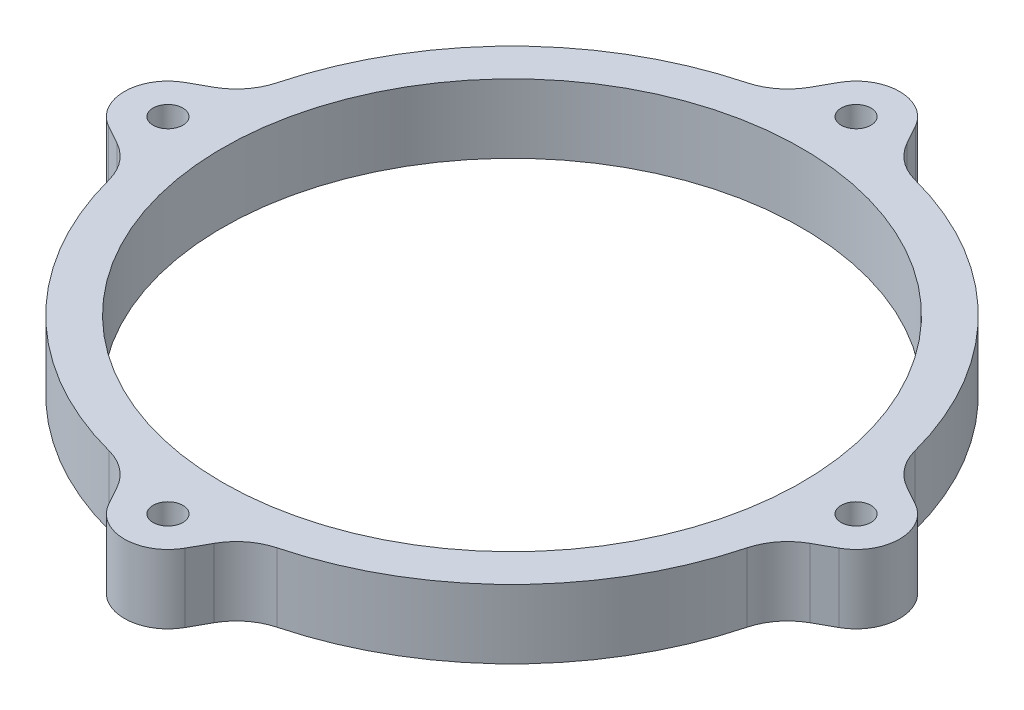
ISO-10303-21;
HEADER;
FILE_DESCRIPTION(('STEP AP214'),'2;1');
FILE_NAME('part.step','',(''),(''),'','','');
FILE_SCHEMA(('AUTOMOTIVE_DESIGN { 1 0 10303 214 1 1 1 1 }'));
ENDSEC;
DATA;
#1=APPLICATION_CONTEXT('core data for automotive mechanical design processes');
#2=APPLICATION_PROTOCOL_DEFINITION('international standard','automotive_design',2000,#1);
#3=PRODUCT_CONTEXT('',#1,'mechanical');
#4=PRODUCT('Part','Part','',(#3));
#5=PRODUCT_RELATED_PRODUCT_CATEGORY('part','',(#4));
#6=PRODUCT_DEFINITION_FORMATION('','',#4);
#7=PRODUCT_DEFINITION_CONTEXT('part definition',#1,'design');
#8=PRODUCT_DEFINITION('design','',#6,#7);
#9=PRODUCT_DEFINITION_SHAPE('','',#8);
#10=(LENGTH_UNIT() NAMED_UNIT(*) SI_UNIT(.MILLI.,.METRE.));
#11=(NAMED_UNIT(*) PLANE_ANGLE_UNIT() SI_UNIT($,.RADIAN.));
#12=(NAMED_UNIT(*) SI_UNIT($,.STERADIAN.) SOLID_ANGLE_UNIT());
#13=UNCERTAINTY_MEASURE_WITH_UNIT(LENGTH_MEASURE(1.E-05),#10,'distance_accuracy_value','');
#14=(GEOMETRIC_REPRESENTATION_CONTEXT(3) GLOBAL_UNCERTAINTY_ASSIGNED_CONTEXT((#13)) GLOBAL_UNIT_ASSIGNED_CONTEXT((#10,
#11,#12)) REPRESENTATION_CONTEXT('',''));
#15=CARTESIAN_POINT('',(0.,0.,0.));
#16=DIRECTION('',(0.,0.,1.));
#17=DIRECTION('',(1.,0.,0.));
#18=AXIS2_PLACEMENT_3D('',#15,#16,#17);
#19=CARTESIAN_POINT('',(0.,12.,-60.));
#20=DIRECTION('',(0.,1.,0.));
#21=DIRECTION('',(0.,0.,1.));
#22=AXIS2_PLACEMENT_3D('',#19,#20,#21);
#23=PLANE('',#22);
#24=CARTESIAN_POINT('',(0.,12.,59.9999999999995));
#25=DIRECTION('',(0.,1.,0.));
#26=DIRECTION('',(0.,0.,1.));
#27=AXIS2_PLACEMENT_3D('',#24,#25,#26);
#28=CIRCLE('',#27,2.6);
#29=CARTESIAN_POINT('',(0.,12.,62.5999999999995));
#30=VERTEX_POINT('',#29);
#31=EDGE_CURVE('E439',#30,#30,#28,.T.);
#32=ORIENTED_EDGE('',*,*,#31,.F.);
#33=EDGE_LOOP('',(#32));
#34=FACE_BOUND('',#33,.T.);
#35=CARTESIAN_POINT('',(0.,12.,-60.));
#36=DIRECTION('',(0.,1.,0.));
#37=DIRECTION('',(0.,0.,1.));
#38=AXIS2_PLACEMENT_3D('',#35,#36,#37);
#39=CIRCLE('',#38,2.6);
#40=CARTESIAN_POINT('',(0.,12.,-57.4));
#41=VERTEX_POINT('',#40);
#42=EDGE_CURVE('E427',#41,#41,#39,.T.);
#43=ORIENTED_EDGE('',*,*,#42,.F.);
#44=EDGE_LOOP('',(#43));
#45=FACE_BOUND('',#44,.T.);
#46=CARTESIAN_POINT('',(0.,12.,-60.));
#47=DIRECTION('',(0.,1.,0.));
#48=DIRECTION('',(0.,0.,1.));
#49=AXIS2_PLACEMENT_3D('',#46,#47,#48);
#50=CIRCLE('',#49,7.60000000000001);
#51=CARTESIAN_POINT('',(6.64110523457601,12.,-63.6953648349367));
#52=VERTEX_POINT('',#51);
#53=CARTESIAN_POINT('',(-6.64110523457601,12.,-63.6953648349368));
#54=VERTEX_POINT('',#53);
#55=EDGE_CURVE('E206',#52,#54,#50,.T.);
#56=ORIENTED_EDGE('',*,*,#55,.T.);
#57=DIRECTION('',(-0.486232215123255,0.,0.873829636128423));
#58=VECTOR('',#57,1.);
#59=CARTESIAN_POINT('',(-6.64110523457601,12.,-63.6953648349368));
#60=LINE('',#59,#58);
#61=CARTESIAN_POINT('',(-8.47082751707193,12.,-60.4070891785733));
#62=VERTEX_POINT('',#61);
#63=EDGE_CURVE('E194',#54,#62,#60,.T.);
#64=ORIENTED_EDGE('',*,*,#63,.T.);
#65=CARTESIAN_POINT('',(-17.2091238783562,12.,-65.2694113298059));
#66=DIRECTION('',(0.,1.,0.));
#67=DIRECTION('',(0.,0.,1.));
#68=AXIS2_PLACEMENT_3D('',#65,#66,#67);
#69=CIRCLE('',#68,10.);
#70=CARTESIAN_POINT('',(-14.6596240445256,12.,-55.5998689105754));
#71=VERTEX_POINT('',#70);
#72=EDGE_CURVE('E279',#62,#71,#69,.F.);
#73=ORIENTED_EDGE('',*,*,#72,.T.);
#74=CARTESIAN_POINT('',(0.,12.,0.));
#75=DIRECTION('',(0.,1.,0.));
#76=DIRECTION('',(0.,0.,1.));
#77=AXIS2_PLACEMENT_3D('',#74,#75,#76);
#78=CIRCLE('',#77,57.5);
#79=CARTESIAN_POINT('',(-55.5998689105754,12.,-14.6596240445256));
#80=VERTEX_POINT('',#79);
#81=EDGE_CURVE('E205',#71,#80,#78,.T.);
#82=ORIENTED_EDGE('',*,*,#81,.T.);
#83=CARTESIAN_POINT('',(-65.2694113298059,12.,-17.2091238783561));
#84=DIRECTION('',(0.,1.,0.));
#85=DIRECTION('',(0.,0.,1.));
#86=AXIS2_PLACEMENT_3D('',#83,#84,#85);
#87=CIRCLE('',#86,10.);
#88=CARTESIAN_POINT('',(-60.4070891785733,12.,-8.47082751707192));
#89=VERTEX_POINT('',#88);
#90=EDGE_CURVE('E283',#80,#89,#87,.F.);
#91=ORIENTED_EDGE('',*,*,#90,.T.);
#92=DIRECTION('',(-0.873829636128422,0.,0.486232215123257));
#93=VECTOR('',#92,1.);
#94=CARTESIAN_POINT('',(-63.6953648349367,12.,-6.641105234576));
#95=LINE('',#94,#93);
#96=CARTESIAN_POINT('',(-63.6953648349368,12.,-6.64110523457601));
#97=VERTEX_POINT('',#96);
#98=EDGE_CURVE('E377',#89,#97,#95,.T.);
#99=ORIENTED_EDGE('',*,*,#98,.T.);
#100=CARTESIAN_POINT('',(-59.9999999999997,12.,0.));
#101=DIRECTION('',(0.,1.,0.));
#102=DIRECTION('',(0.,0.,1.));
#103=AXIS2_PLACEMENT_3D('',#100,#101,#102);
#104=CIRCLE('',#103,7.60000000000016);
#105=CARTESIAN_POINT('',(-63.6953648349368,12.,6.64110523457603));
#106=VERTEX_POINT('',#105);
#107=EDGE_CURVE('E374',#97,#106,#104,.T.);
#108=ORIENTED_EDGE('',*,*,#107,.T.);
#109=DIRECTION('',(0.873829636128423,0.,0.486232215123255));
#110=VECTOR('',#109,1.);
#111=CARTESIAN_POINT('',(-63.6953648349368,12.,6.64110523457603));
#112=LINE('',#111,#110);
#113=CARTESIAN_POINT('',(-60.4070891785733,12.,8.47082751707194));
#114=VERTEX_POINT('',#113);
#115=EDGE_CURVE('E366',#106,#114,#112,.T.);
#116=ORIENTED_EDGE('',*,*,#115,.T.);
#117=CARTESIAN_POINT('',(-65.2694113298059,12.,17.2091238783562));
#118=DIRECTION('',(0.,1.,0.));
#119=DIRECTION('',(0.,0.,1.));
#120=AXIS2_PLACEMENT_3D('',#117,#118,#119);
#121=CIRCLE('',#120,10.);
#122=CARTESIAN_POINT('',(-55.5998689105754,12.,14.6596240445256));
#123=VERTEX_POINT('',#122);
#124=EDGE_CURVE('E287',#114,#123,#121,.F.);
#125=ORIENTED_EDGE('',*,*,#124,.T.);
#126=CARTESIAN_POINT('',(0.,12.,0.));
#127=DIRECTION('',(0.,1.,0.));
#128=DIRECTION('',(0.,0.,1.));
#129=AXIS2_PLACEMENT_3D('',#126,#127,#128);
#130=CIRCLE('',#129,57.5);
#131=CARTESIAN_POINT('',(-14.6596240445256,12.,55.5998689105754));
#132=VERTEX_POINT('',#131);
#133=EDGE_CURVE('E298',#123,#132,#130,.T.);
#134=ORIENTED_EDGE('',*,*,#133,.T.);
#135=CARTESIAN_POINT('',(-17.2091238783561,12.,65.2694113298059));
#136=DIRECTION('',(0.,1.,0.));
#137=DIRECTION('',(0.,0.,1.));
#138=AXIS2_PLACEMENT_3D('',#135,#136,#137);
#139=CIRCLE('',#138,10.);
#140=CARTESIAN_POINT('',(-8.47082751707192,12.,60.4070891785733));
#141=VERTEX_POINT('',#140);
#142=EDGE_CURVE('E291',#132,#141,#139,.F.);
#143=ORIENTED_EDGE('',*,*,#142,.T.);
#144=DIRECTION('',(0.486232215123257,0.,0.873829636128422));
#145=VECTOR('',#144,1.);
#146=CARTESIAN_POINT('',(-6.641105234576,12.,63.6953648349367));
#147=LINE('',#146,#145);
#148=CARTESIAN_POINT('',(-6.64110523457602,12.,63.6953648349367));
#149=VERTEX_POINT('',#148);
#150=EDGE_CURVE('E295',#141,#149,#147,.T.);
#151=ORIENTED_EDGE('',*,*,#150,.T.);
#152=CARTESIAN_POINT('',(0.,12.,59.9999999999995));
#153=DIRECTION('',(0.,1.,0.));
#154=DIRECTION('',(0.,0.,1.));
#155=AXIS2_PLACEMENT_3D('',#152,#153,#154);
#156=CIRCLE('',#155,7.60000000000023);
#157=CARTESIAN_POINT('',(6.64110523457602,12.,63.6953648349368));
#158=VERTEX_POINT('',#157);
#159=EDGE_CURVE('E308',#149,#158,#156,.T.);
#160=ORIENTED_EDGE('',*,*,#159,.T.);
#161=DIRECTION('',(0.486232215123255,0.,-0.873829636128423));
#162=VECTOR('',#161,1.);
#163=CARTESIAN_POINT('',(6.64110523457602,12.,63.6953648349368));
#164=LINE('',#163,#162);
#165=CARTESIAN_POINT('',(8.47082751707193,12.,60.4070891785733));
#166=VERTEX_POINT('',#165);
#167=EDGE_CURVE('E382',#158,#166,#164,.T.);
#168=ORIENTED_EDGE('',*,*,#167,.T.);
#169=CARTESIAN_POINT('',(17.2091238783562,12.,65.2694113298059));
#170=DIRECTION('',(0.,1.,0.));
#171=DIRECTION('',(0.,0.,1.));
#172=AXIS2_PLACEMENT_3D('',#169,#170,#171);
#173=CIRCLE('',#172,10.);
#174=CARTESIAN_POINT('',(14.6596240445256,12.,55.5998689105754));
#175=VERTEX_POINT('',#174);
#176=EDGE_CURVE('E11',#166,#175,#173,.F.);
#177=ORIENTED_EDGE('',*,*,#176,.T.);
#178=CARTESIAN_POINT('',(0.,12.,0.));
#179=DIRECTION('',(0.,1.,0.));
#180=DIRECTION('',(0.,0.,1.));
#181=AXIS2_PLACEMENT_3D('',#178,#179,#180);
#182=CIRCLE('',#181,57.5);
#183=CARTESIAN_POINT('',(55.5998689105754,12.,14.6596240445256));
#184=VERTEX_POINT('',#183);
#185=EDGE_CURVE('E384',#175,#184,#182,.T.);
#186=ORIENTED_EDGE('',*,*,#185,.T.);
#187=CARTESIAN_POINT('',(65.2694113298059,12.,17.2091238783562));
#188=DIRECTION('',(0.,1.,0.));
#189=DIRECTION('',(0.,0.,1.));
#190=AXIS2_PLACEMENT_3D('',#187,#188,#189);
#191=CIRCLE('',#190,10.);
#192=CARTESIAN_POINT('',(60.4070891785733,12.,8.47082751707193));
#193=VERTEX_POINT('',#192);
#194=EDGE_CURVE('E267',#184,#193,#191,.F.);
#195=ORIENTED_EDGE('',*,*,#194,.T.);
#196=DIRECTION('',(0.873829636128422,0.,-0.486232215123257));
#197=VECTOR('',#196,1.);
#198=CARTESIAN_POINT('',(63.6953648349367,12.,6.64110523457601));
#199=LINE('',#198,#197);
#200=CARTESIAN_POINT('',(63.6953648349365,12.,6.64110523457559));
#201=VERTEX_POINT('',#200);
#202=EDGE_CURVE('E387',#193,#201,#199,.T.);
#203=ORIENTED_EDGE('',*,*,#202,.T.);
#204=CARTESIAN_POINT('',(59.9999999999999,12.,-5.62050406216485E-13));
#205=DIRECTION('',(0.,1.,0.));
#206=DIRECTION('',(0.,0.,1.));
#207=AXIS2_PLACEMENT_3D('',#204,#205,#206);
#208=CIRCLE('',#207,7.60000000000005);
#209=CARTESIAN_POINT('',(63.6953648349368,12.,-6.64110523457602));
#210=VERTEX_POINT('',#209);
#211=EDGE_CURVE('E389',#201,#210,#208,.T.);
#212=ORIENTED_EDGE('',*,*,#211,.T.);
#213=DIRECTION('',(-0.873829636128423,0.,-0.486232215123255));
#214=VECTOR('',#213,1.);
#215=CARTESIAN_POINT('',(63.6953648349368,12.,-6.64110523457602));
#216=LINE('',#215,#214);
#217=CARTESIAN_POINT('',(60.4070891785733,12.,-8.47082751707193));
#218=VERTEX_POINT('',#217);
#219=EDGE_CURVE('E391',#210,#218,#216,.T.);
#220=ORIENTED_EDGE('',*,*,#219,.T.);
#221=CARTESIAN_POINT('',(65.2694113298059,12.,-17.2091238783562));
#222=DIRECTION('',(0.,1.,0.));
#223=DIRECTION('',(0.,0.,1.));
#224=AXIS2_PLACEMENT_3D('',#221,#222,#223);
#225=CIRCLE('',#224,10.);
#226=CARTESIAN_POINT('',(55.5998689105754,12.,-14.6596240445256));
#227=VERTEX_POINT('',#226);
#228=EDGE_CURVE('E271',#218,#227,#225,.F.);
#229=ORIENTED_EDGE('',*,*,#228,.T.);
#230=CARTESIAN_POINT('',(0.,12.,0.));
#231=DIRECTION('',(0.,1.,0.));
#232=DIRECTION('',(0.,0.,1.));
#233=AXIS2_PLACEMENT_3D('',#230,#231,#232);
#234=CIRCLE('',#233,57.5);
#235=CARTESIAN_POINT('',(14.6596240445256,12.,-55.5998689105754));
#236=VERTEX_POINT('',#235);
#237=EDGE_CURVE('E394',#227,#236,#234,.T.);
#238=ORIENTED_EDGE('',*,*,#237,.T.);
#239=CARTESIAN_POINT('',(17.2091238783562,12.,-65.2694113298059));
#240=DIRECTION('',(0.,1.,0.));
#241=DIRECTION('',(0.,0.,1.));
#242=AXIS2_PLACEMENT_3D('',#239,#240,#241);
#243=CIRCLE('',#242,10.);
#244=CARTESIAN_POINT('',(8.47082751707193,12.,-60.4070891785733));
#245=VERTEX_POINT('',#244);
#246=EDGE_CURVE('E275',#236,#245,#243,.F.);
#247=ORIENTED_EDGE('',*,*,#246,.T.);
#248=DIRECTION('',(-0.486232215123257,0.,-0.873829636128422));
#249=VECTOR('',#248,1.);
#250=CARTESIAN_POINT('',(6.64110523457601,12.,-63.6953648349367));
#251=LINE('',#250,#249);
#252=EDGE_CURVE('E211',#245,#52,#251,.T.);
#253=ORIENTED_EDGE('',*,*,#252,.T.);
#254=EDGE_LOOP('',(#56,#64,#73,#82,#91,#99,#108,#116,#125,#134,#143,#151,#160,#168,#177,#186,
#195,#203,#212,#220,#229,#238,#247,#253));
#255=FACE_BOUND('',#254,.T.);
#256=CARTESIAN_POINT('',(0.,12.,0.));
#257=DIRECTION('',(0.,1.,0.));
#258=DIRECTION('',(0.,0.,1.));
#259=AXIS2_PLACEMENT_3D('',#256,#257,#258);
#260=CIRCLE('',#259,50.5);
#261=CARTESIAN_POINT('',(0.,12.,50.5));
#262=VERTEX_POINT('',#261);
#263=EDGE_CURVE('E400',#262,#262,#260,.T.);
#264=ORIENTED_EDGE('',*,*,#263,.F.);
#265=EDGE_LOOP('',(#264));
#266=FACE_BOUND('',#265,.T.);
#267=CARTESIAN_POINT('',(59.9999999999999,12.,-5.62050406216485E-13));
#268=DIRECTION('',(0.,1.,0.));
#269=DIRECTION('',(0.,0.,1.));
#270=AXIS2_PLACEMENT_3D('',#267,#268,#269);
#271=CIRCLE('',#270,2.6);
#272=CARTESIAN_POINT('',(59.9999999999999,12.,2.59999999999944));
#273=VERTEX_POINT('',#272);
#274=EDGE_CURVE('E433',#273,#273,#271,.T.);
#275=ORIENTED_EDGE('',*,*,#274,.F.);
#276=EDGE_LOOP('',(#275));
#277=FACE_BOUND('',#276,.T.);
#278=CARTESIAN_POINT('',(-59.9999999999997,12.,0.));
#279=DIRECTION('',(0.,1.,0.));
#280=DIRECTION('',(0.,0.,1.));
#281=AXIS2_PLACEMENT_3D('',#278,#279,#280);
#282=CIRCLE('',#281,2.6);
#283=CARTESIAN_POINT('',(-59.9999999999997,12.,2.6));
#284=VERTEX_POINT('',#283);
#285=EDGE_CURVE('E445',#284,#284,#282,.T.);
#286=ORIENTED_EDGE('',*,*,#285,.F.);
#287=EDGE_LOOP('',(#286));
#288=FACE_BOUND('',#287,.T.);
#289=ADVANCED_FACE('F33',(#34,#45,#255,#266,#277,#288),#23,.T.);
#290=CARTESIAN_POINT('',(0.,0.,-60.));
#291=DIRECTION('',(0.,1.,0.));
#292=DIRECTION('',(0.,0.,1.));
#293=AXIS2_PLACEMENT_3D('',#290,#291,#292);
#294=PLANE('',#293);
#295=CARTESIAN_POINT('',(0.,0.,-60.));
#296=DIRECTION('',(0.,1.,0.));
#297=DIRECTION('',(0.,0.,1.));
#298=AXIS2_PLACEMENT_3D('',#295,#296,#297);
#299=CIRCLE('',#298,7.60000000000001);
#300=CARTESIAN_POINT('',(6.64110523457601,0.,-63.6953648349367));
#301=VERTEX_POINT('',#300);
#302=CARTESIAN_POINT('',(-6.64110523457601,0.,-63.6953648349368));
#303=VERTEX_POINT('',#302);
#304=EDGE_CURVE('E219',#301,#303,#299,.T.);
#305=ORIENTED_EDGE('',*,*,#304,.F.);
#306=DIRECTION('',(-0.486232215123257,0.,-0.873829636128422));
#307=VECTOR('',#306,1.);
#308=CARTESIAN_POINT('',(6.64110523457601,0.,-63.6953648349367));
#309=LINE('',#308,#307);
#310=CARTESIAN_POINT('',(8.47082751707193,0.,-60.4070891785733));
#311=VERTEX_POINT('',#310);
#312=EDGE_CURVE('E215',#311,#301,#309,.T.);
#313=ORIENTED_EDGE('',*,*,#312,.F.);
#314=CARTESIAN_POINT('',(17.2091238783562,0.,-65.2694113298059));
#315=DIRECTION('',(0.,1.,0.));
#316=DIRECTION('',(0.,0.,1.));
#317=AXIS2_PLACEMENT_3D('',#314,#315,#316);
#318=CIRCLE('',#317,10.);
#319=CARTESIAN_POINT('',(14.6596240445256,0.,-55.5998689105754));
#320=VERTEX_POINT('',#319);
#321=EDGE_CURVE('E273',#311,#320,#318,.T.);
#322=ORIENTED_EDGE('',*,*,#321,.T.);
#323=CARTESIAN_POINT('',(0.,0.,0.));
#324=DIRECTION('',(0.,1.,0.));
#325=DIRECTION('',(0.,0.,1.));
#326=AXIS2_PLACEMENT_3D('',#323,#324,#325);
#327=CIRCLE('',#326,57.5);
#328=CARTESIAN_POINT('',(55.5998689105754,0.,-14.6596240445256));
#329=VERTEX_POINT('',#328);
#330=EDGE_CURVE('E343',#329,#320,#327,.T.);
#331=ORIENTED_EDGE('',*,*,#330,.F.);
#332=CARTESIAN_POINT('',(65.2694113298059,0.,-17.2091238783562));
#333=DIRECTION('',(0.,1.,0.));
#334=DIRECTION('',(0.,0.,1.));
#335=AXIS2_PLACEMENT_3D('',#332,#333,#334);
#336=CIRCLE('',#335,10.);
#337=CARTESIAN_POINT('',(60.4070891785733,0.,-8.47082751707193));
#338=VERTEX_POINT('',#337);
#339=EDGE_CURVE('E269',#329,#338,#336,.T.);
#340=ORIENTED_EDGE('',*,*,#339,.T.);
#341=DIRECTION('',(-0.873829636128423,0.,-0.486232215123255));
#342=VECTOR('',#341,1.);
#343=CARTESIAN_POINT('',(63.6953648349368,0.,-6.64110523457602));
#344=LINE('',#343,#342);
#345=CARTESIAN_POINT('',(63.6953648349368,0.,-6.64110523457602));
#346=VERTEX_POINT('',#345);
#347=EDGE_CURVE('E340',#346,#338,#344,.T.);
#348=ORIENTED_EDGE('',*,*,#347,.F.);
#349=CARTESIAN_POINT('',(59.9999999999999,0.,-5.62050406216485E-13));
#350=DIRECTION('',(0.,1.,0.));
#351=DIRECTION('',(0.,0.,1.));
#352=AXIS2_PLACEMENT_3D('',#349,#350,#351);
#353=CIRCLE('',#352,7.60000000000005);
#354=CARTESIAN_POINT('',(63.6953648349365,0.,6.64110523457559));
#355=VERTEX_POINT('',#354);
#356=EDGE_CURVE('E338',#355,#346,#353,.T.);
#357=ORIENTED_EDGE('',*,*,#356,.F.);
#358=DIRECTION('',(0.873829636128422,0.,-0.486232215123257));
#359=VECTOR('',#358,1.);
#360=CARTESIAN_POINT('',(63.6953648349367,0.,6.64110523457601));
#361=LINE('',#360,#359);
#362=CARTESIAN_POINT('',(60.4070891785733,0.,8.47082751707193));
#363=VERTEX_POINT('',#362);
#364=EDGE_CURVE('E336',#363,#355,#361,.T.);
#365=ORIENTED_EDGE('',*,*,#364,.F.);
#366=CARTESIAN_POINT('',(65.2694113298059,0.,17.2091238783562));
#367=DIRECTION('',(0.,1.,0.));
#368=DIRECTION('',(0.,0.,1.));
#369=AXIS2_PLACEMENT_3D('',#366,#367,#368);
#370=CIRCLE('',#369,10.);
#371=CARTESIAN_POINT('',(55.5998689105754,0.,14.6596240445256));
#372=VERTEX_POINT('',#371);
#373=EDGE_CURVE('E265',#363,#372,#370,.T.);
#374=ORIENTED_EDGE('',*,*,#373,.T.);
#375=CARTESIAN_POINT('',(0.,0.,0.));
#376=DIRECTION('',(0.,1.,0.));
#377=DIRECTION('',(0.,0.,1.));
#378=AXIS2_PLACEMENT_3D('',#375,#376,#377);
#379=CIRCLE('',#378,57.5);
#380=CARTESIAN_POINT('',(14.6596240445256,0.,55.5998689105754));
#381=VERTEX_POINT('',#380);
#382=EDGE_CURVE('E333',#381,#372,#379,.T.);
#383=ORIENTED_EDGE('',*,*,#382,.F.);
#384=CARTESIAN_POINT('',(17.2091238783562,0.,65.2694113298059));
#385=DIRECTION('',(0.,1.,0.));
#386=DIRECTION('',(0.,0.,1.));
#387=AXIS2_PLACEMENT_3D('',#384,#385,#386);
#388=CIRCLE('',#387,10.);
#389=CARTESIAN_POINT('',(8.47082751707193,0.,60.4070891785733));
#390=VERTEX_POINT('',#389);
#391=EDGE_CURVE('E41',#381,#390,#388,.T.);
#392=ORIENTED_EDGE('',*,*,#391,.T.);
#393=DIRECTION('',(0.486232215123255,0.,-0.873829636128423));
#394=VECTOR('',#393,1.);
#395=CARTESIAN_POINT('',(6.64110523457602,0.,63.6953648349368));
#396=LINE('',#395,#394);
#397=CARTESIAN_POINT('',(6.64110523457602,0.,63.6953648349368));
#398=VERTEX_POINT('',#397);
#399=EDGE_CURVE('E331',#398,#390,#396,.T.);
#400=ORIENTED_EDGE('',*,*,#399,.F.);
#401=CARTESIAN_POINT('',(0.,0.,59.9999999999995));
#402=DIRECTION('',(0.,1.,0.));
#403=DIRECTION('',(0.,0.,1.));
#404=AXIS2_PLACEMENT_3D('',#401,#402,#403);
#405=CIRCLE('',#404,7.60000000000023);
#406=CARTESIAN_POINT('',(-6.64110523457602,0.,63.6953648349367));
#407=VERTEX_POINT('',#406);
#408=EDGE_CURVE('E323',#407,#398,#405,.T.);
#409=ORIENTED_EDGE('',*,*,#408,.F.);
#410=DIRECTION('',(0.486232215123257,0.,0.873829636128422));
#411=VECTOR('',#410,1.);
#412=CARTESIAN_POINT('',(-6.641105234576,0.,63.6953648349367));
#413=LINE('',#412,#411);
#414=CARTESIAN_POINT('',(-8.47082751707192,0.,60.4070891785733));
#415=VERTEX_POINT('',#414);
#416=EDGE_CURVE('E317',#415,#407,#413,.T.);
#417=ORIENTED_EDGE('',*,*,#416,.F.);
#418=CARTESIAN_POINT('',(-17.2091238783561,0.,65.2694113298059));
#419=DIRECTION('',(0.,1.,0.));
#420=DIRECTION('',(0.,0.,1.));
#421=AXIS2_PLACEMENT_3D('',#418,#419,#420);
#422=CIRCLE('',#421,10.);
#423=CARTESIAN_POINT('',(-14.6596240445256,0.,55.5998689105754));
#424=VERTEX_POINT('',#423);
#425=EDGE_CURVE('E289',#415,#424,#422,.T.);
#426=ORIENTED_EDGE('',*,*,#425,.T.);
#427=CARTESIAN_POINT('',(0.,0.,0.));
#428=DIRECTION('',(0.,1.,0.));
#429=DIRECTION('',(0.,0.,1.));
#430=AXIS2_PLACEMENT_3D('',#427,#428,#429);
#431=CIRCLE('',#430,57.5);
#432=CARTESIAN_POINT('',(-55.5998689105754,0.,14.6596240445256));
#433=VERTEX_POINT('',#432);
#434=EDGE_CURVE('E315',#433,#424,#431,.T.);
#435=ORIENTED_EDGE('',*,*,#434,.F.);
#436=CARTESIAN_POINT('',(-65.2694113298059,0.,17.2091238783562));
#437=DIRECTION('',(0.,1.,0.));
#438=DIRECTION('',(0.,0.,1.));
#439=AXIS2_PLACEMENT_3D('',#436,#437,#438);
#440=CIRCLE('',#439,10.);
#441=CARTESIAN_POINT('',(-60.4070891785733,0.,8.47082751707194));
#442=VERTEX_POINT('',#441);
#443=EDGE_CURVE('E285',#433,#442,#440,.T.);
#444=ORIENTED_EDGE('',*,*,#443,.T.);
#445=DIRECTION('',(0.873829636128423,0.,0.486232215123255));
#446=VECTOR('',#445,1.);
#447=CARTESIAN_POINT('',(-63.6953648349368,0.,6.64110523457603));
#448=LINE('',#447,#446);
#449=CARTESIAN_POINT('',(-63.6953648349368,0.,6.64110523457603));
#450=VERTEX_POINT('',#449);
#451=EDGE_CURVE('E321',#450,#442,#448,.T.);
#452=ORIENTED_EDGE('',*,*,#451,.F.);
#453=CARTESIAN_POINT('',(-59.9999999999997,0.,0.));
#454=DIRECTION('',(0.,1.,0.));
#455=DIRECTION('',(0.,0.,1.));
#456=AXIS2_PLACEMENT_3D('',#453,#454,#455);
#457=CIRCLE('',#456,7.60000000000016);
#458=CARTESIAN_POINT('',(-63.6953648349368,0.,-6.64110523457601));
#459=VERTEX_POINT('',#458);
#460=EDGE_CURVE('E326',#459,#450,#457,.T.);
#461=ORIENTED_EDGE('',*,*,#460,.F.);
#462=DIRECTION('',(-0.873829636128422,0.,0.486232215123257));
#463=VECTOR('',#462,1.);
#464=CARTESIAN_POINT('',(-63.6953648349367,0.,-6.641105234576));
#465=LINE('',#464,#463);
#466=CARTESIAN_POINT('',(-60.4070891785733,0.,-8.47082751707192));
#467=VERTEX_POINT('',#466);
#468=EDGE_CURVE('E405',#467,#459,#465,.T.);
#469=ORIENTED_EDGE('',*,*,#468,.F.);
#470=CARTESIAN_POINT('',(-65.2694113298059,0.,-17.2091238783561));
#471=DIRECTION('',(0.,1.,0.));
#472=DIRECTION('',(0.,0.,1.));
#473=AXIS2_PLACEMENT_3D('',#470,#471,#472);
#474=CIRCLE('',#473,10.);
#475=CARTESIAN_POINT('',(-55.5998689105754,0.,-14.6596240445256));
#476=VERTEX_POINT('',#475);
#477=EDGE_CURVE('E281',#467,#476,#474,.T.);
#478=ORIENTED_EDGE('',*,*,#477,.T.);
#479=CARTESIAN_POINT('',(0.,0.,0.));
#480=DIRECTION('',(0.,1.,0.));
#481=DIRECTION('',(0.,0.,1.));
#482=AXIS2_PLACEMENT_3D('',#479,#480,#481);
#483=CIRCLE('',#482,57.5);
#484=CARTESIAN_POINT('',(-14.6596240445256,0.,-55.5998689105754));
#485=VERTEX_POINT('',#484);
#486=EDGE_CURVE('E402',#485,#476,#483,.T.);
#487=ORIENTED_EDGE('',*,*,#486,.F.);
#488=CARTESIAN_POINT('',(-17.2091238783562,0.,-65.2694113298059));
#489=DIRECTION('',(0.,1.,0.));
#490=DIRECTION('',(0.,0.,1.));
#491=AXIS2_PLACEMENT_3D('',#488,#489,#490);
#492=CIRCLE('',#491,10.);
#493=CARTESIAN_POINT('',(-8.47082751707193,0.,-60.4070891785733));
#494=VERTEX_POINT('',#493);
#495=EDGE_CURVE('E277',#485,#494,#492,.T.);
#496=ORIENTED_EDGE('',*,*,#495,.T.);
#497=DIRECTION('',(-0.486232215123255,0.,0.873829636128423));
#498=VECTOR('',#497,1.);
#499=CARTESIAN_POINT('',(-6.64110523457601,0.,-63.6953648349368));
#500=LINE('',#499,#498);
#501=EDGE_CURVE('E399',#303,#494,#500,.T.);
#502=ORIENTED_EDGE('',*,*,#501,.F.);
#503=EDGE_LOOP('',(#305,#313,#322,#331,#340,#348,#357,#365,#374,#383,#392,#400,#409,#417,#426,
#435,#444,#452,#461,#469,#478,#487,#496,#502));
#504=FACE_BOUND('',#503,.T.);
#505=CARTESIAN_POINT('',(0.,0.,0.));
#506=DIRECTION('',(0.,1.,0.));
#507=DIRECTION('',(0.,0.,1.));
#508=AXIS2_PLACEMENT_3D('',#505,#506,#507);
#509=CIRCLE('',#508,50.5);
#510=CARTESIAN_POINT('',(0.,0.,50.5));
#511=VERTEX_POINT('',#510);
#512=EDGE_CURVE('E424',#511,#511,#509,.T.);
#513=ORIENTED_EDGE('',*,*,#512,.T.);
#514=EDGE_LOOP('',(#513));
#515=FACE_BOUND('',#514,.T.);
#516=CARTESIAN_POINT('',(0.,0.,-60.));
#517=DIRECTION('',(0.,1.,0.));
#518=DIRECTION('',(0.,0.,1.));
#519=AXIS2_PLACEMENT_3D('',#516,#517,#518);
#520=CIRCLE('',#519,2.6);
#521=CARTESIAN_POINT('',(0.,0.,-57.4));
#522=VERTEX_POINT('',#521);
#523=EDGE_CURVE('E430',#522,#522,#520,.T.);
#524=ORIENTED_EDGE('',*,*,#523,.T.);
#525=EDGE_LOOP('',(#524));
#526=FACE_BOUND('',#525,.T.);
#527=CARTESIAN_POINT('',(59.9999999999999,0.,-5.62050406216485E-13));
#528=DIRECTION('',(0.,1.,0.));
#529=DIRECTION('',(0.,0.,1.));
#530=AXIS2_PLACEMENT_3D('',#527,#528,#529);
#531=CIRCLE('',#530,2.6);
#532=CARTESIAN_POINT('',(59.9999999999999,0.,2.59999999999944));
#533=VERTEX_POINT('',#532);
#534=EDGE_CURVE('E436',#533,#533,#531,.T.);
#535=ORIENTED_EDGE('',*,*,#534,.T.);
#536=EDGE_LOOP('',(#535));
#537=FACE_BOUND('',#536,.T.);
#538=CARTESIAN_POINT('',(0.,0.,59.9999999999995));
#539=DIRECTION('',(0.,1.,0.));
#540=DIRECTION('',(0.,0.,1.));
#541=AXIS2_PLACEMENT_3D('',#538,#539,#540);
#542=CIRCLE('',#541,2.6);
#543=CARTESIAN_POINT('',(0.,0.,62.5999999999995));
#544=VERTEX_POINT('',#543);
#545=EDGE_CURVE('E442',#544,#544,#542,.T.);
#546=ORIENTED_EDGE('',*,*,#545,.T.);
#547=EDGE_LOOP('',(#546));
#548=FACE_BOUND('',#547,.T.);
#549=CARTESIAN_POINT('',(-59.9999999999997,0.,0.));
#550=DIRECTION('',(0.,1.,0.));
#551=DIRECTION('',(0.,0.,1.));
#552=AXIS2_PLACEMENT_3D('',#549,#550,#551);
#553=CIRCLE('',#552,2.6);
#554=CARTESIAN_POINT('',(-59.9999999999997,0.,2.6));
#555=VERTEX_POINT('',#554);
#556=EDGE_CURVE('E448',#555,#555,#553,.T.);
#557=ORIENTED_EDGE('',*,*,#556,.T.);
#558=EDGE_LOOP('',(#557));
#559=FACE_BOUND('',#558,.T.);
#560=ADVANCED_FACE('F313',(#504,#515,#526,#537,#548,#559),#294,.F.);
#561=CARTESIAN_POINT('',(0.,12.,-60.));
#562=DIRECTION('',(0.,-1.,0.));
#563=DIRECTION('',(0.,0.,-1.));
#564=AXIS2_PLACEMENT_3D('',#561,#562,#563);
#565=CYLINDRICAL_SURFACE('',#564,7.60000000000001);
#566=ORIENTED_EDGE('',*,*,#304,.T.);
#567=DIRECTION('',(0.,-1.,0.));
#568=VECTOR('',#567,1.);
#569=CARTESIAN_POINT('',(-6.64110523457601,12.,-63.6953648349368));
#570=LINE('',#569,#568);
#571=EDGE_CURVE('E199',#54,#303,#570,.T.);
#572=ORIENTED_EDGE('',*,*,#571,.F.);
#573=ORIENTED_EDGE('',*,*,#55,.F.);
#574=DIRECTION('',(0.,-1.,0.));
#575=VECTOR('',#574,1.);
#576=CARTESIAN_POINT('',(6.64110523457601,12.,-63.6953648349367));
#577=LINE('',#576,#575);
#578=EDGE_CURVE('E347',#52,#301,#577,.T.);
#579=ORIENTED_EDGE('',*,*,#578,.T.);
#580=EDGE_LOOP('',(#566,#572,#573,#579));
#581=FACE_BOUND('',#580,.T.);
#582=ADVANCED_FACE('F217',(#581),#565,.T.);
#583=CARTESIAN_POINT('',(-6.64110523457601,12.,-63.6953648349368));
#584=DIRECTION('',(0.873829636128423,0.,0.486232215123255));
#585=DIRECTION('',(0.486232215123255,0.,-0.873829636128423));
#586=AXIS2_PLACEMENT_3D('',#583,#584,#585);
#587=PLANE('',#586);
#588=ORIENTED_EDGE('',*,*,#501,.T.);
#589=DIRECTION('',(0.,1.,0.));
#590=VECTOR('',#589,1.);
#591=CARTESIAN_POINT('',(-8.47082751707192,12.,-60.4070891785733));
#592=LINE('',#591,#590);
#593=EDGE_CURVE('E202',#494,#62,#592,.T.);
#594=ORIENTED_EDGE('',*,*,#593,.T.);
#595=ORIENTED_EDGE('',*,*,#63,.F.);
#596=ORIENTED_EDGE('',*,*,#571,.T.);
#597=EDGE_LOOP('',(#588,#594,#595,#596));
#598=FACE_BOUND('',#597,.T.);
#599=ADVANCED_FACE('F197',(#598),#587,.F.);
#600=CARTESIAN_POINT('',(0.,12.,0.));
#601=DIRECTION('',(0.,-1.,0.));
#602=DIRECTION('',(0.,0.,-1.));
#603=AXIS2_PLACEMENT_3D('',#600,#601,#602);
#604=CYLINDRICAL_SURFACE('',#603,57.5);
#605=ORIENTED_EDGE('',*,*,#81,.F.);
#606=DIRECTION('',(0.,-1.,0.));
#607=VECTOR('',#606,1.);
#608=CARTESIAN_POINT('',(-14.6596240445256,12.,-55.5998689105754));
#609=LINE('',#608,#607);
#610=EDGE_CURVE('E247',#71,#485,#609,.T.);
#611=ORIENTED_EDGE('',*,*,#610,.T.);
#612=ORIENTED_EDGE('',*,*,#486,.T.);
#613=DIRECTION('',(0.,-1.,0.));
#614=VECTOR('',#613,1.);
#615=CARTESIAN_POINT('',(-55.5998689105754,12.,-14.6596240445256));
#616=LINE('',#615,#614);
#617=EDGE_CURVE('E245',#476,#80,#616,.F.);
#618=ORIENTED_EDGE('',*,*,#617,.T.);
#619=EDGE_LOOP('',(#605,#611,#612,#618));
#620=FACE_BOUND('',#619,.T.);
#621=ADVANCED_FACE('F417',(#620),#604,.T.);
#622=CARTESIAN_POINT('',(-63.6953648349367,12.,-6.641105234576));
#623=DIRECTION('',(0.486232215123257,0.,0.873829636128422));
#624=DIRECTION('',(0.873829636128422,0.,-0.486232215123257));
#625=AXIS2_PLACEMENT_3D('',#622,#623,#624);
#626=PLANE('',#625);
#627=ORIENTED_EDGE('',*,*,#98,.F.);
#628=DIRECTION('',(0.,1.,0.));
#629=VECTOR('',#628,1.);
#630=CARTESIAN_POINT('',(-60.4070891785733,0.,-8.47082751707192));
#631=LINE('',#630,#629);
#632=EDGE_CURVE('E251',#89,#467,#631,.F.);
#633=ORIENTED_EDGE('',*,*,#632,.T.);
#634=ORIENTED_EDGE('',*,*,#468,.T.);
#635=DIRECTION('',(0.,-1.,0.));
#636=VECTOR('',#635,1.);
#637=CARTESIAN_POINT('',(-63.6953648349368,12.,-6.64110523457601));
#638=LINE('',#637,#636);
#639=EDGE_CURVE('E221',#97,#459,#638,.T.);
#640=ORIENTED_EDGE('',*,*,#639,.F.);
#641=EDGE_LOOP('',(#627,#633,#634,#640));
#642=FACE_BOUND('',#641,.T.);
#643=ADVANCED_FACE('F410',(#642),#626,.F.);
#644=CARTESIAN_POINT('',(-59.9999999999997,12.,0.));
#645=DIRECTION('',(0.,-1.,0.));
#646=DIRECTION('',(0.,0.,-1.));
#647=AXIS2_PLACEMENT_3D('',#644,#645,#646);
#648=CYLINDRICAL_SURFACE('',#647,7.60000000000016);
#649=ORIENTED_EDGE('',*,*,#460,.T.);
#650=DIRECTION('',(0.,-1.,0.));
#651=VECTOR('',#650,1.);
#652=CARTESIAN_POINT('',(-63.6953648349368,12.,6.64110523457603));
#653=LINE('',#652,#651);
#654=EDGE_CURVE('E227',#106,#450,#653,.T.);
#655=ORIENTED_EDGE('',*,*,#654,.F.);
#656=ORIENTED_EDGE('',*,*,#107,.F.);
#657=ORIENTED_EDGE('',*,*,#639,.T.);
#658=EDGE_LOOP('',(#649,#655,#656,#657));
#659=FACE_BOUND('',#658,.T.);
#660=ADVANCED_FACE('F406',(#659),#648,.T.);
#661=CARTESIAN_POINT('',(-63.6953648349368,12.,6.64110523457603));
#662=DIRECTION('',(0.486232215123255,0.,-0.873829636128423));
#663=DIRECTION('',(-0.873829636128423,0.,-0.486232215123255));
#664=AXIS2_PLACEMENT_3D('',#661,#662,#663);
#665=PLANE('',#664);
#666=ORIENTED_EDGE('',*,*,#451,.T.);
#667=DIRECTION('',(0.,1.,0.));
#668=VECTOR('',#667,1.);
#669=CARTESIAN_POINT('',(-60.4070891785733,12.,8.47082751707194));
#670=LINE('',#669,#668);
#671=EDGE_CURVE('E259',#442,#114,#670,.T.);
#672=ORIENTED_EDGE('',*,*,#671,.T.);
#673=ORIENTED_EDGE('',*,*,#115,.F.);
#674=ORIENTED_EDGE('',*,*,#654,.T.);
#675=EDGE_LOOP('',(#666,#672,#673,#674));
#676=FACE_BOUND('',#675,.T.);
#677=ADVANCED_FACE('F363',(#676),#665,.F.);
#678=CARTESIAN_POINT('',(0.,12.,0.));
#679=DIRECTION('',(0.,-1.,0.));
#680=DIRECTION('',(0.,0.,-1.));
#681=AXIS2_PLACEMENT_3D('',#678,#679,#680);
#682=CYLINDRICAL_SURFACE('',#681,57.5);
#683=ORIENTED_EDGE('',*,*,#133,.F.);
#684=DIRECTION('',(0.,-1.,0.));
#685=VECTOR('',#684,1.);
#686=CARTESIAN_POINT('',(-55.5998689105754,12.,14.6596240445256));
#687=LINE('',#686,#685);
#688=EDGE_CURVE('E256',#123,#433,#687,.T.);
#689=ORIENTED_EDGE('',*,*,#688,.T.);
#690=ORIENTED_EDGE('',*,*,#434,.T.);
#691=DIRECTION('',(0.,-1.,0.));
#692=VECTOR('',#691,1.);
#693=CARTESIAN_POINT('',(-14.6596240445256,12.,55.5998689105754));
#694=LINE('',#693,#692);
#695=EDGE_CURVE('E254',#424,#132,#694,.F.);
#696=ORIENTED_EDGE('',*,*,#695,.T.);
#697=EDGE_LOOP('',(#683,#689,#690,#696));
#698=FACE_BOUND('',#697,.T.);
#699=ADVANCED_FACE('F319',(#698),#682,.T.);
#700=CARTESIAN_POINT('',(-6.641105234576,12.,63.6953648349367));
#701=DIRECTION('',(0.873829636128422,0.,-0.486232215123257));
#702=DIRECTION('',(-0.486232215123257,0.,-0.873829636128422));
#703=AXIS2_PLACEMENT_3D('',#700,#701,#702);
#704=PLANE('',#703);
#705=ORIENTED_EDGE('',*,*,#150,.F.);
#706=DIRECTION('',(0.,1.,0.));
#707=VECTOR('',#706,1.);
#708=CARTESIAN_POINT('',(-8.47082751707192,0.,60.4070891785733));
#709=LINE('',#708,#707);
#710=EDGE_CURVE('E261',#141,#415,#709,.F.);
#711=ORIENTED_EDGE('',*,*,#710,.T.);
#712=ORIENTED_EDGE('',*,*,#416,.T.);
#713=DIRECTION('',(0.,-1.,0.));
#714=VECTOR('',#713,1.);
#715=CARTESIAN_POINT('',(-6.64110523457602,12.,63.6953648349367));
#716=LINE('',#715,#714);
#717=EDGE_CURVE('E306',#149,#407,#716,.T.);
#718=ORIENTED_EDGE('',*,*,#717,.F.);
#719=EDGE_LOOP('',(#705,#711,#712,#718));
#720=FACE_BOUND('',#719,.T.);
#721=ADVANCED_FACE('F303',(#720),#704,.F.);
#722=CARTESIAN_POINT('',(0.,12.,59.9999999999995));
#723=DIRECTION('',(0.,-1.,0.));
#724=DIRECTION('',(0.,0.,-1.));
#725=AXIS2_PLACEMENT_3D('',#722,#723,#724);
#726=CYLINDRICAL_SURFACE('',#725,7.60000000000023);
#727=ORIENTED_EDGE('',*,*,#408,.T.);
#728=DIRECTION('',(0.,-1.,0.));
#729=VECTOR('',#728,1.);
#730=CARTESIAN_POINT('',(6.64110523457602,12.,63.6953648349368));
#731=LINE('',#730,#729);
#732=EDGE_CURVE('E355',#158,#398,#731,.T.);
#733=ORIENTED_EDGE('',*,*,#732,.F.);
#734=ORIENTED_EDGE('',*,*,#159,.F.);
#735=ORIENTED_EDGE('',*,*,#717,.T.);
#736=EDGE_LOOP('',(#727,#733,#734,#735));
#737=FACE_BOUND('',#736,.T.);
#738=ADVANCED_FACE('F497',(#737),#726,.T.);
#739=CARTESIAN_POINT('',(6.64110523457602,12.,63.6953648349368));
#740=DIRECTION('',(-0.873829636128423,0.,-0.486232215123255));
#741=DIRECTION('',(-0.486232215123255,0.,0.873829636128423));
#742=AXIS2_PLACEMENT_3D('',#739,#740,#741);
#743=PLANE('',#742);
#744=ORIENTED_EDGE('',*,*,#399,.T.);
#745=DIRECTION('',(0.,1.,0.));
#746=VECTOR('',#745,1.);
#747=CARTESIAN_POINT('',(8.47082751707193,12.,60.4070891785733));
#748=LINE('',#747,#746);
#749=EDGE_CURVE('E48',#390,#166,#748,.T.);
#750=ORIENTED_EDGE('',*,*,#749,.T.);
#751=ORIENTED_EDGE('',*,*,#167,.F.);
#752=ORIENTED_EDGE('',*,*,#732,.T.);
#753=EDGE_LOOP('',(#744,#750,#751,#752));
#754=FACE_BOUND('',#753,.T.);
#755=ADVANCED_FACE('F493',(#754),#743,.F.);
#756=CARTESIAN_POINT('',(0.,12.,0.));
#757=DIRECTION('',(0.,-1.,0.));
#758=DIRECTION('',(0.,0.,-1.));
#759=AXIS2_PLACEMENT_3D('',#756,#757,#758);
#760=CYLINDRICAL_SURFACE('',#759,57.5);
#761=ORIENTED_EDGE('',*,*,#382,.T.);
#762=DIRECTION('',(0.,-1.,0.));
#763=VECTOR('',#762,1.);
#764=CARTESIAN_POINT('',(55.5998689105754,12.,14.6596240445256));
#765=LINE('',#764,#763);
#766=EDGE_CURVE('E233',#372,#184,#765,.F.);
#767=ORIENTED_EDGE('',*,*,#766,.T.);
#768=ORIENTED_EDGE('',*,*,#185,.F.);
#769=DIRECTION('',(0.,-1.,0.));
#770=VECTOR('',#769,1.);
#771=CARTESIAN_POINT('',(14.6596240445256,12.,55.5998689105754));
#772=LINE('',#771,#770);
#773=EDGE_CURVE('E224',#175,#381,#772,.T.);
#774=ORIENTED_EDGE('',*,*,#773,.T.);
#775=EDGE_LOOP('',(#761,#767,#768,#774));
#776=FACE_BOUND('',#775,.T.);
#777=ADVANCED_FACE('F489',(#776),#760,.T.);
#778=CARTESIAN_POINT('',(63.6953648349367,12.,6.64110523457601));
#779=DIRECTION('',(-0.486232215123257,0.,-0.873829636128422));
#780=DIRECTION('',(-0.873829636128422,0.,0.486232215123257));
#781=AXIS2_PLACEMENT_3D('',#778,#779,#780);
#782=PLANE('',#781);
#783=ORIENTED_EDGE('',*,*,#202,.F.);
#784=DIRECTION('',(0.,1.,0.));
#785=VECTOR('',#784,1.);
#786=CARTESIAN_POINT('',(60.4070891785733,0.,8.47082751707193));
#787=LINE('',#786,#785);
#788=EDGE_CURVE('E220',#193,#363,#787,.F.);
#789=ORIENTED_EDGE('',*,*,#788,.T.);
#790=ORIENTED_EDGE('',*,*,#364,.T.);
#791=DIRECTION('',(0.,-1.,0.));
#792=VECTOR('',#791,1.);
#793=CARTESIAN_POINT('',(63.6953648349365,12.,6.64110523457559));
#794=LINE('',#793,#792);
#795=EDGE_CURVE('E352',#201,#355,#794,.T.);
#796=ORIENTED_EDGE('',*,*,#795,.F.);
#797=EDGE_LOOP('',(#783,#789,#790,#796));
#798=FACE_BOUND('',#797,.T.);
#799=ADVANCED_FACE('F485',(#798),#782,.F.);
#800=CARTESIAN_POINT('',(59.9999999999999,12.,-5.62050406216485E-13));
#801=DIRECTION('',(0.,-1.,0.));
#802=DIRECTION('',(0.,0.,-1.));
#803=AXIS2_PLACEMENT_3D('',#800,#801,#802);
#804=CYLINDRICAL_SURFACE('',#803,7.60000000000005);
#805=ORIENTED_EDGE('',*,*,#356,.T.);
#806=DIRECTION('',(0.,-1.,0.));
#807=VECTOR('',#806,1.);
#808=CARTESIAN_POINT('',(63.6953648349368,12.,-6.64110523457602));
#809=LINE('',#808,#807);
#810=EDGE_CURVE('E349',#210,#346,#809,.T.);
#811=ORIENTED_EDGE('',*,*,#810,.F.);
#812=ORIENTED_EDGE('',*,*,#211,.F.);
#813=ORIENTED_EDGE('',*,*,#795,.T.);
#814=EDGE_LOOP('',(#805,#811,#812,#813));
#815=FACE_BOUND('',#814,.T.);
#816=ADVANCED_FACE('F481',(#815),#804,.T.);
#817=CARTESIAN_POINT('',(63.6953648349368,12.,-6.64110523457602));
#818=DIRECTION('',(-0.486232215123255,0.,0.873829636128423));
#819=DIRECTION('',(0.873829636128423,0.,0.486232215123255));
#820=AXIS2_PLACEMENT_3D('',#817,#818,#819);
#821=PLANE('',#820);
#822=ORIENTED_EDGE('',*,*,#347,.T.);
#823=DIRECTION('',(0.,1.,0.));
#824=VECTOR('',#823,1.);
#825=CARTESIAN_POINT('',(60.4070891785733,12.,-8.47082751707193));
#826=LINE('',#825,#824);
#827=EDGE_CURVE('E240',#338,#218,#826,.T.);
#828=ORIENTED_EDGE('',*,*,#827,.T.);
#829=ORIENTED_EDGE('',*,*,#219,.F.);
#830=ORIENTED_EDGE('',*,*,#810,.T.);
#831=EDGE_LOOP('',(#822,#828,#829,#830));
#832=FACE_BOUND('',#831,.T.);
#833=ADVANCED_FACE('F477',(#832),#821,.F.);
#834=CARTESIAN_POINT('',(0.,12.,0.));
#835=DIRECTION('',(0.,-1.,0.));
#836=DIRECTION('',(0.,0.,-1.));
#837=AXIS2_PLACEMENT_3D('',#834,#835,#836);
#838=CYLINDRICAL_SURFACE('',#837,57.5);
#839=ORIENTED_EDGE('',*,*,#237,.F.);
#840=DIRECTION('',(0.,-1.,0.));
#841=VECTOR('',#840,1.);
#842=CARTESIAN_POINT('',(55.5998689105754,12.,-14.6596240445256));
#843=LINE('',#842,#841);
#844=EDGE_CURVE('E237',#227,#329,#843,.T.);
#845=ORIENTED_EDGE('',*,*,#844,.T.);
#846=ORIENTED_EDGE('',*,*,#330,.T.);
#847=DIRECTION('',(0.,-1.,0.));
#848=VECTOR('',#847,1.);
#849=CARTESIAN_POINT('',(14.6596240445256,12.,-55.5998689105754));
#850=LINE('',#849,#848);
#851=EDGE_CURVE('E235',#320,#236,#850,.F.);
#852=ORIENTED_EDGE('',*,*,#851,.T.);
#853=EDGE_LOOP('',(#839,#845,#846,#852));
#854=FACE_BOUND('',#853,.T.);
#855=ADVANCED_FACE('F473',(#854),#838,.T.);
#856=CARTESIAN_POINT('',(6.64110523457601,12.,-63.6953648349367));
#857=DIRECTION('',(-0.873829636128422,0.,0.486232215123257));
#858=DIRECTION('',(0.486232215123257,0.,0.873829636128422));
#859=AXIS2_PLACEMENT_3D('',#856,#857,#858);
#860=PLANE('',#859);
#861=ORIENTED_EDGE('',*,*,#252,.F.);
#862=DIRECTION('',(0.,1.,0.));
#863=VECTOR('',#862,1.);
#864=CARTESIAN_POINT('',(8.47082751707193,0.,-60.4070891785733));
#865=LINE('',#864,#863);
#866=EDGE_CURVE('E242',#245,#311,#865,.F.);
#867=ORIENTED_EDGE('',*,*,#866,.T.);
#868=ORIENTED_EDGE('',*,*,#312,.T.);
#869=ORIENTED_EDGE('',*,*,#578,.F.);
#870=EDGE_LOOP('',(#861,#867,#868,#869));
#871=FACE_BOUND('',#870,.T.);
#872=ADVANCED_FACE('F470',(#871),#860,.F.);
#873=CARTESIAN_POINT('',(0.,12.,0.));
#874=DIRECTION('',(0.,-1.,0.));
#875=DIRECTION('',(0.,0.,-1.));
#876=AXIS2_PLACEMENT_3D('',#873,#874,#875);
#877=CYLINDRICAL_SURFACE('',#876,50.5);
#878=ORIENTED_EDGE('',*,*,#263,.T.);
#879=EDGE_LOOP('',(#878));
#880=FACE_BOUND('',#879,.T.);
#881=ORIENTED_EDGE('',*,*,#512,.F.);
#882=EDGE_LOOP('',(#881));
#883=FACE_BOUND('',#882,.T.);
#884=ADVANCED_FACE('F467',(#880,#883),#877,.F.);
#885=CARTESIAN_POINT('',(0.,12.,-60.));
#886=DIRECTION('',(0.,-1.,0.));
#887=DIRECTION('',(0.,0.,-1.));
#888=AXIS2_PLACEMENT_3D('',#885,#886,#887);
#889=CYLINDRICAL_SURFACE('',#888,2.6);
#890=ORIENTED_EDGE('',*,*,#42,.T.);
#891=EDGE_LOOP('',(#890));
#892=FACE_BOUND('',#891,.T.);
#893=ORIENTED_EDGE('',*,*,#523,.F.);
#894=EDGE_LOOP('',(#893));
#895=FACE_BOUND('',#894,.T.);
#896=ADVANCED_FACE('F723',(#892,#895),#889,.F.);
#897=CARTESIAN_POINT('',(59.9999999999999,12.,-5.62050406216485E-13));
#898=DIRECTION('',(0.,-1.,0.));
#899=DIRECTION('',(0.,0.,-1.));
#900=AXIS2_PLACEMENT_3D('',#897,#898,#899);
#901=CYLINDRICAL_SURFACE('',#900,2.6);
#902=ORIENTED_EDGE('',*,*,#274,.T.);
#903=EDGE_LOOP('',(#902));
#904=FACE_BOUND('',#903,.T.);
#905=ORIENTED_EDGE('',*,*,#534,.F.);
#906=EDGE_LOOP('',(#905));
#907=FACE_BOUND('',#906,.T.);
#908=ADVANCED_FACE('F713',(#904,#907),#901,.F.);
#909=CARTESIAN_POINT('',(0.,12.,59.9999999999995));
#910=DIRECTION('',(0.,-1.,0.));
#911=DIRECTION('',(0.,0.,-1.));
#912=AXIS2_PLACEMENT_3D('',#909,#910,#911);
#913=CYLINDRICAL_SURFACE('',#912,2.6);
#914=ORIENTED_EDGE('',*,*,#31,.T.);
#915=EDGE_LOOP('',(#914));
#916=FACE_BOUND('',#915,.T.);
#917=ORIENTED_EDGE('',*,*,#545,.F.);
#918=EDGE_LOOP('',(#917));
#919=FACE_BOUND('',#918,.T.);
#920=ADVANCED_FACE('F704',(#916,#919),#913,.F.);
#921=CARTESIAN_POINT('',(-59.9999999999997,12.,0.));
#922=DIRECTION('',(0.,-1.,0.));
#923=DIRECTION('',(0.,0.,-1.));
#924=AXIS2_PLACEMENT_3D('',#921,#922,#923);
#925=CYLINDRICAL_SURFACE('',#924,2.6);
#926=ORIENTED_EDGE('',*,*,#285,.T.);
#927=EDGE_LOOP('',(#926));
#928=FACE_BOUND('',#927,.T.);
#929=ORIENTED_EDGE('',*,*,#556,.F.);
#930=EDGE_LOOP('',(#929));
#931=FACE_BOUND('',#930,.T.);
#932=ADVANCED_FACE('F454',(#928,#931),#925,.F.);
#933=CARTESIAN_POINT('',(65.2694113298059,12.,17.2091238783562));
#934=DIRECTION('',(0.,-1.,0.));
#935=DIRECTION('',(0.,0.,-1.));
#936=AXIS2_PLACEMENT_3D('',#933,#934,#935);
#937=CYLINDRICAL_SURFACE('',#936,10.);
#938=ORIENTED_EDGE('',*,*,#194,.F.);
#939=ORIENTED_EDGE('',*,*,#766,.F.);
#940=ORIENTED_EDGE('',*,*,#373,.F.);
#941=ORIENTED_EDGE('',*,*,#788,.F.);
#942=EDGE_LOOP('',(#938,#939,#940,#941));
#943=FACE_BOUND('',#942,.T.);
#944=ADVANCED_FACE('F517',(#943),#937,.F.);
#945=CARTESIAN_POINT('',(65.2694113298059,12.,-17.2091238783562));
#946=DIRECTION('',(0.,-1.,0.));
#947=DIRECTION('',(0.,0.,-1.));
#948=AXIS2_PLACEMENT_3D('',#945,#946,#947);
#949=CYLINDRICAL_SURFACE('',#948,10.);
#950=ORIENTED_EDGE('',*,*,#228,.F.);
#951=ORIENTED_EDGE('',*,*,#827,.F.);
#952=ORIENTED_EDGE('',*,*,#339,.F.);
#953=ORIENTED_EDGE('',*,*,#844,.F.);
#954=EDGE_LOOP('',(#950,#951,#952,#953));
#955=FACE_BOUND('',#954,.T.);
#956=ADVANCED_FACE('F520',(#955),#949,.F.);
#957=CARTESIAN_POINT('',(17.2091238783562,12.,-65.2694113298059));
#958=DIRECTION('',(0.,-1.,0.));
#959=DIRECTION('',(0.,0.,-1.));
#960=AXIS2_PLACEMENT_3D('',#957,#958,#959);
#961=CYLINDRICAL_SURFACE('',#960,10.);
#962=ORIENTED_EDGE('',*,*,#246,.F.);
#963=ORIENTED_EDGE('',*,*,#851,.F.);
#964=ORIENTED_EDGE('',*,*,#321,.F.);
#965=ORIENTED_EDGE('',*,*,#866,.F.);
#966=EDGE_LOOP('',(#962,#963,#964,#965));
#967=FACE_BOUND('',#966,.T.);
#968=ADVANCED_FACE('F524',(#967),#961,.F.);
#969=CARTESIAN_POINT('',(-17.2091238783562,12.,-65.2694113298059));
#970=DIRECTION('',(0.,-1.,0.));
#971=DIRECTION('',(0.,0.,-1.));
#972=AXIS2_PLACEMENT_3D('',#969,#970,#971);
#973=CYLINDRICAL_SURFACE('',#972,10.);
#974=ORIENTED_EDGE('',*,*,#72,.F.);
#975=ORIENTED_EDGE('',*,*,#593,.F.);
#976=ORIENTED_EDGE('',*,*,#495,.F.);
#977=ORIENTED_EDGE('',*,*,#610,.F.);
#978=EDGE_LOOP('',(#974,#975,#976,#977));
#979=FACE_BOUND('',#978,.T.);
#980=ADVANCED_FACE('F528',(#979),#973,.F.);
#981=CARTESIAN_POINT('',(-65.2694113298059,12.,-17.2091238783561));
#982=DIRECTION('',(0.,-1.,0.));
#983=DIRECTION('',(0.,0.,-1.));
#984=AXIS2_PLACEMENT_3D('',#981,#982,#983);
#985=CYLINDRICAL_SURFACE('',#984,10.);
#986=ORIENTED_EDGE('',*,*,#90,.F.);
#987=ORIENTED_EDGE('',*,*,#617,.F.);
#988=ORIENTED_EDGE('',*,*,#477,.F.);
#989=ORIENTED_EDGE('',*,*,#632,.F.);
#990=EDGE_LOOP('',(#986,#987,#988,#989));
#991=FACE_BOUND('',#990,.T.);
#992=ADVANCED_FACE('F421',(#991),#985,.F.);
#993=CARTESIAN_POINT('',(-65.2694113298059,12.,17.2091238783562));
#994=DIRECTION('',(0.,-1.,0.));
#995=DIRECTION('',(0.,0.,-1.));
#996=AXIS2_PLACEMENT_3D('',#993,#994,#995);
#997=CYLINDRICAL_SURFACE('',#996,10.);
#998=ORIENTED_EDGE('',*,*,#124,.F.);
#999=ORIENTED_EDGE('',*,*,#671,.F.);
#1000=ORIENTED_EDGE('',*,*,#443,.F.);
#1001=ORIENTED_EDGE('',*,*,#688,.F.);
#1002=EDGE_LOOP('',(#998,#999,#1000,#1001));
#1003=FACE_BOUND('',#1002,.T.);
#1004=ADVANCED_FACE('F373',(#1003),#997,.F.);
#1005=CARTESIAN_POINT('',(-17.2091238783561,12.,65.2694113298059));
#1006=DIRECTION('',(0.,-1.,0.));
#1007=DIRECTION('',(0.,0.,-1.));
#1008=AXIS2_PLACEMENT_3D('',#1005,#1006,#1007);
#1009=CYLINDRICAL_SURFACE('',#1008,10.);
#1010=ORIENTED_EDGE('',*,*,#142,.F.);
#1011=ORIENTED_EDGE('',*,*,#695,.F.);
#1012=ORIENTED_EDGE('',*,*,#425,.F.);
#1013=ORIENTED_EDGE('',*,*,#710,.F.);
#1014=EDGE_LOOP('',(#1010,#1011,#1012,#1013));
#1015=FACE_BOUND('',#1014,.T.);
#1016=ADVANCED_FACE('F310',(#1015),#1009,.F.);
#1017=CARTESIAN_POINT('',(17.2091238783562,12.,65.2694113298059));
#1018=DIRECTION('',(0.,-1.,0.));
#1019=DIRECTION('',(0.,0.,-1.));
#1020=AXIS2_PLACEMENT_3D('',#1017,#1018,#1019);
#1021=CYLINDRICAL_SURFACE('',#1020,10.);
#1022=ORIENTED_EDGE('',*,*,#176,.F.);
#1023=ORIENTED_EDGE('',*,*,#749,.F.);
#1024=ORIENTED_EDGE('',*,*,#391,.F.);
#1025=ORIENTED_EDGE('',*,*,#773,.F.);
#1026=EDGE_LOOP('',(#1022,#1023,#1024,#1025));
#1027=FACE_BOUND('',#1026,.T.);
#1028=ADVANCED_FACE('F35',(#1027),#1021,.F.);
#1029=CLOSED_SHELL('',(#289,#560,#582,#599,#621,#643,#660,#677,#699,#721,#738,#755,#777,#799,
#816,#833,#855,#872,#884,#896,#908,#920,#932,#944,#956,#968,#980,#992,#1004,#1016,#1028));
#1030=MANIFOLD_SOLID_BREP('B2',#1029);
#1031=ADVANCED_BREP_SHAPE_REPRESENTATION('',(#18,#1030),#14);
#1032=SHAPE_DEFINITION_REPRESENTATION(#9,#1031);
ENDSEC;
END-ISO-10303-21;
